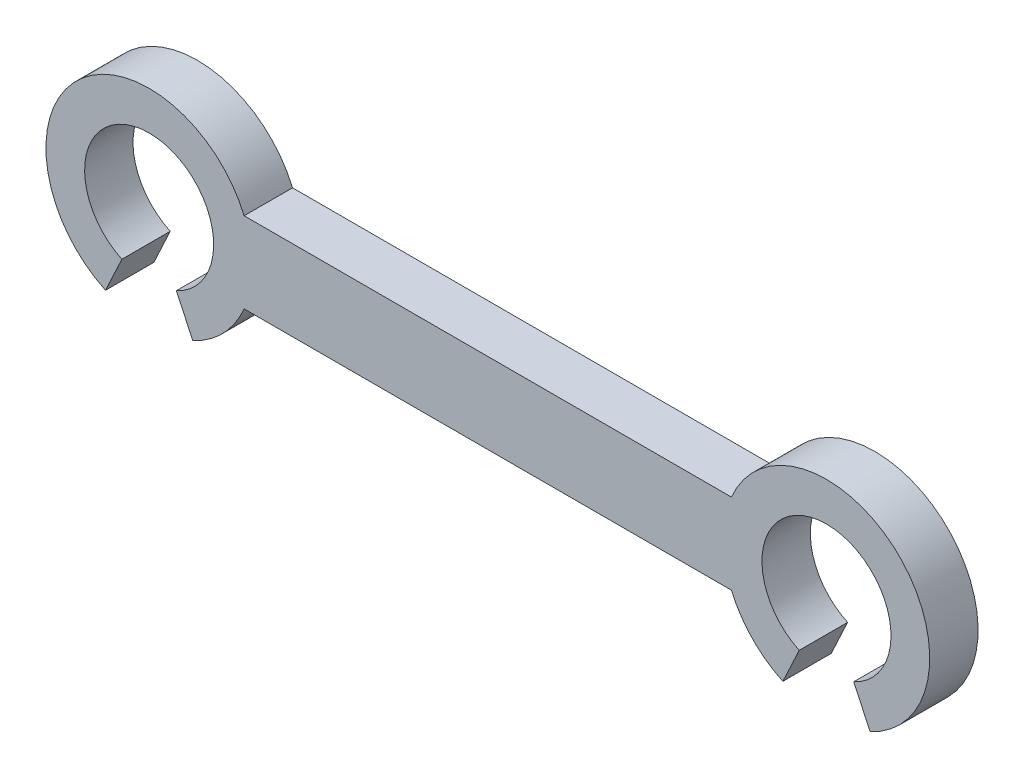
ISO-10303-21;
HEADER;
FILE_DESCRIPTION(('STEP AP214'),'2;1');
FILE_NAME('part.step','',(''),(''),'','','');
FILE_SCHEMA(('AUTOMOTIVE_DESIGN { 1 0 10303 214 1 1 1 1 }'));
ENDSEC;
DATA;
#1=APPLICATION_CONTEXT('core data for automotive mechanical design processes');
#2=APPLICATION_PROTOCOL_DEFINITION('international standard','automotive_design',2000,#1);
#3=PRODUCT_CONTEXT('',#1,'mechanical');
#4=PRODUCT('Part','Part','',(#3));
#5=PRODUCT_RELATED_PRODUCT_CATEGORY('part','',(#4));
#6=PRODUCT_DEFINITION_FORMATION('','',#4);
#7=PRODUCT_DEFINITION_CONTEXT('part definition',#1,'design');
#8=PRODUCT_DEFINITION('design','',#6,#7);
#9=PRODUCT_DEFINITION_SHAPE('','',#8);
#10=(LENGTH_UNIT() NAMED_UNIT(*) SI_UNIT(.MILLI.,.METRE.));
#11=(NAMED_UNIT(*) PLANE_ANGLE_UNIT() SI_UNIT($,.RADIAN.));
#12=(NAMED_UNIT(*) SI_UNIT($,.STERADIAN.) SOLID_ANGLE_UNIT());
#13=UNCERTAINTY_MEASURE_WITH_UNIT(LENGTH_MEASURE(1.E-05),#10,'distance_accuracy_value','');
#14=(GEOMETRIC_REPRESENTATION_CONTEXT(3) GLOBAL_UNCERTAINTY_ASSIGNED_CONTEXT((#13)) GLOBAL_UNIT_ASSIGNED_CONTEXT((#10,
#11,#12)) REPRESENTATION_CONTEXT('',''));
#15=CARTESIAN_POINT('',(0.,0.,0.));
#16=DIRECTION('',(0.,0.,1.));
#17=DIRECTION('',(1.,0.,0.));
#18=AXIS2_PLACEMENT_3D('',#15,#16,#17);
#19=CARTESIAN_POINT('',(-10.5,0.,1.5));
#20=DIRECTION('',(0.,0.,-1.));
#21=DIRECTION('',(-1.,0.,0.));
#22=AXIS2_PLACEMENT_3D('',#19,#20,#21);
#23=CYLINDRICAL_SURFACE('',#22,2.);
#24=CARTESIAN_POINT('',(-10.5,0.,0.));
#25=DIRECTION('',(0.,0.,1.));
#26=DIRECTION('',(1.,0.,0.));
#27=AXIS2_PLACEMENT_3D('',#24,#25,#26);
#28=CIRCLE('',#27,2.);
#29=CARTESIAN_POINT('',(-9.6547634765186,-1.8126155740733,0.));
#30=VERTEX_POINT('',#29);
#31=CARTESIAN_POINT('',(-11.3452365234814,-1.8126155740733,0.));
#32=VERTEX_POINT('',#31);
#33=EDGE_CURVE('E160',#30,#32,#28,.T.);
#34=ORIENTED_EDGE('',*,*,#33,.F.);
#35=DIRECTION('',(0.,0.,-1.));
#36=VECTOR('',#35,1.);
#37=CARTESIAN_POINT('',(-9.6547634765186,-1.8126155740733,1.5));
#38=LINE('',#37,#36);
#39=CARTESIAN_POINT('',(-9.6547634765186,-1.8126155740733,1.5));
#40=VERTEX_POINT('',#39);
#41=EDGE_CURVE('E11',#40,#30,#38,.T.);
#42=ORIENTED_EDGE('',*,*,#41,.F.);
#43=CARTESIAN_POINT('',(-10.5,0.,1.5));
#44=DIRECTION('',(0.,0.,1.));
#45=DIRECTION('',(1.,0.,0.));
#46=AXIS2_PLACEMENT_3D('',#43,#44,#45);
#47=CIRCLE('',#46,2.);
#48=CARTESIAN_POINT('',(-11.3452365234814,-1.8126155740733,1.5));
#49=VERTEX_POINT('',#48);
#50=EDGE_CURVE('E188',#40,#49,#47,.T.);
#51=ORIENTED_EDGE('',*,*,#50,.T.);
#52=DIRECTION('',(0.,0.,-1.));
#53=VECTOR('',#52,1.);
#54=CARTESIAN_POINT('',(-11.3452365234814,-1.8126155740733,1.5));
#55=LINE('',#54,#53);
#56=EDGE_CURVE('E57',#49,#32,#55,.T.);
#57=ORIENTED_EDGE('',*,*,#56,.T.);
#58=EDGE_LOOP('',(#34,#42,#51,#57));
#59=FACE_BOUND('',#58,.T.);
#60=ADVANCED_FACE('F41',(#59),#23,.F.);
#61=CARTESIAN_POINT('',(-8.62463495085432,-4.02173332637464,1.5));
#62=DIRECTION('',(0.906307787036649,0.4226182617407,0.));
#63=DIRECTION('',(-0.4226182617407,0.90630778703665,0.));
#64=AXIS2_PLACEMENT_3D('',#61,#62,#63);
#65=PLANE('',#64);
#66=DIRECTION('',(0.4226182617407,-0.90630778703665,0.));
#67=VECTOR('',#66,1.);
#68=CARTESIAN_POINT('',(-8.62463495085432,-4.02173332637464,0.));
#69=LINE('',#68,#67);
#70=CARTESIAN_POINT('',(-9.14762156242976,-2.90018491851728,0.));
#71=VERTEX_POINT('',#70);
#72=EDGE_CURVE('E162',#30,#71,#69,.T.);
#73=ORIENTED_EDGE('',*,*,#72,.T.);
#74=DIRECTION('',(0.,0.,-1.));
#75=VECTOR('',#74,1.);
#76=CARTESIAN_POINT('',(-9.14762156242976,-2.90018491851728,1.5));
#77=LINE('',#76,#75);
#78=CARTESIAN_POINT('',(-9.14762156242976,-2.90018491851728,1.5));
#79=VERTEX_POINT('',#78);
#80=EDGE_CURVE('E49',#79,#71,#77,.T.);
#81=ORIENTED_EDGE('',*,*,#80,.F.);
#82=DIRECTION('',(0.4226182617407,-0.90630778703665,0.));
#83=VECTOR('',#82,1.);
#84=CARTESIAN_POINT('',(-8.62463495085432,-4.02173332637464,1.5));
#85=LINE('',#84,#83);
#86=EDGE_CURVE('E403',#40,#79,#85,.T.);
#87=ORIENTED_EDGE('',*,*,#86,.F.);
#88=ORIENTED_EDGE('',*,*,#41,.T.);
#89=EDGE_LOOP('',(#73,#81,#87,#88));
#90=FACE_BOUND('',#89,.T.);
#91=ADVANCED_FACE('F260',(#90),#65,.F.);
#92=CARTESIAN_POINT('',(-10.5,0.,1.5));
#93=DIRECTION('',(0.,0.,-1.));
#94=DIRECTION('',(-1.,0.,0.));
#95=AXIS2_PLACEMENT_3D('',#92,#93,#94);
#96=CYLINDRICAL_SURFACE('',#95,3.2);
#97=CARTESIAN_POINT('',(-10.5,0.,0.));
#98=DIRECTION('',(0.,0.,1.));
#99=DIRECTION('',(1.,0.,0.));
#100=AXIS2_PLACEMENT_3D('',#97,#98,#99);
#101=CIRCLE('',#100,3.2);
#102=CARTESIAN_POINT('',(-7.55424033566891,-1.25,0.));
#103=VERTEX_POINT('',#102);
#104=EDGE_CURVE('E164',#71,#103,#101,.T.);
#105=ORIENTED_EDGE('',*,*,#104,.T.);
#106=DIRECTION('',(0.,0.,-1.));
#107=VECTOR('',#106,1.);
#108=CARTESIAN_POINT('',(-7.55424033566891,-1.25,1.5));
#109=LINE('',#108,#107);
#110=CARTESIAN_POINT('',(-7.55424033566891,-1.25,1.5));
#111=VERTEX_POINT('',#110);
#112=EDGE_CURVE('E204',#111,#103,#109,.T.);
#113=ORIENTED_EDGE('',*,*,#112,.F.);
#114=CARTESIAN_POINT('',(-10.5,0.,1.5));
#115=DIRECTION('',(0.,0.,1.));
#116=DIRECTION('',(1.,0.,0.));
#117=AXIS2_PLACEMENT_3D('',#114,#115,#116);
#118=CIRCLE('',#117,3.2);
#119=EDGE_CURVE('E213',#79,#111,#118,.T.);
#120=ORIENTED_EDGE('',*,*,#119,.F.);
#121=ORIENTED_EDGE('',*,*,#80,.T.);
#122=EDGE_LOOP('',(#105,#113,#120,#121));
#123=FACE_BOUND('',#122,.T.);
#124=ADVANCED_FACE('F211',(#123),#96,.T.);
#125=CARTESIAN_POINT('',(0.,-1.25,1.5));
#126=DIRECTION('',(0.,1.,0.));
#127=DIRECTION('',(0.,0.,1.));
#128=AXIS2_PLACEMENT_3D('',#125,#126,#127);
#129=PLANE('',#128);
#130=DIRECTION('',(1.,0.,0.));
#131=VECTOR('',#130,1.);
#132=CARTESIAN_POINT('',(0.,-1.25,0.));
#133=LINE('',#132,#131);
#134=CARTESIAN_POINT('',(7.55424033566891,-1.25,0.));
#135=VERTEX_POINT('',#134);
#136=EDGE_CURVE('E166',#103,#135,#133,.T.);
#137=ORIENTED_EDGE('',*,*,#136,.T.);
#138=DIRECTION('',(0.,0.,-1.));
#139=VECTOR('',#138,1.);
#140=CARTESIAN_POINT('',(7.55424033566891,-1.25,1.5));
#141=LINE('',#140,#139);
#142=CARTESIAN_POINT('',(7.55424033566891,-1.25,1.5));
#143=VERTEX_POINT('',#142);
#144=EDGE_CURVE('E201',#143,#135,#141,.T.);
#145=ORIENTED_EDGE('',*,*,#144,.F.);
#146=DIRECTION('',(1.,0.,0.));
#147=VECTOR('',#146,1.);
#148=CARTESIAN_POINT('',(0.,-1.25,1.5));
#149=LINE('',#148,#147);
#150=EDGE_CURVE('E232',#111,#143,#149,.T.);
#151=ORIENTED_EDGE('',*,*,#150,.F.);
#152=ORIENTED_EDGE('',*,*,#112,.T.);
#153=EDGE_LOOP('',(#137,#145,#151,#152));
#154=FACE_BOUND('',#153,.T.);
#155=ADVANCED_FACE('F222',(#154),#129,.F.);
#156=CARTESIAN_POINT('',(10.5,0.,1.5));
#157=DIRECTION('',(0.,0.,-1.));
#158=DIRECTION('',(-1.,0.,0.));
#159=AXIS2_PLACEMENT_3D('',#156,#157,#158);
#160=CYLINDRICAL_SURFACE('',#159,3.2);
#161=CARTESIAN_POINT('',(10.5,0.,0.));
#162=DIRECTION('',(0.,0.,1.));
#163=DIRECTION('',(1.,0.,0.));
#164=AXIS2_PLACEMENT_3D('',#161,#162,#163);
#165=CIRCLE('',#164,3.2);
#166=CARTESIAN_POINT('',(9.14762156242976,-2.90018491851728,0.));
#167=VERTEX_POINT('',#166);
#168=EDGE_CURVE('E168',#135,#167,#165,.T.);
#169=ORIENTED_EDGE('',*,*,#168,.T.);
#170=DIRECTION('',(0.,0.,-1.));
#171=VECTOR('',#170,1.);
#172=CARTESIAN_POINT('',(9.14762156242976,-2.90018491851728,1.5));
#173=LINE('',#172,#171);
#174=CARTESIAN_POINT('',(9.14762156242976,-2.90018491851728,1.5));
#175=VERTEX_POINT('',#174);
#176=EDGE_CURVE('E199',#175,#167,#173,.T.);
#177=ORIENTED_EDGE('',*,*,#176,.F.);
#178=CARTESIAN_POINT('',(10.5,0.,1.5));
#179=DIRECTION('',(0.,0.,1.));
#180=DIRECTION('',(1.,0.,0.));
#181=AXIS2_PLACEMENT_3D('',#178,#179,#180);
#182=CIRCLE('',#181,3.2);
#183=EDGE_CURVE('E228',#143,#175,#182,.T.);
#184=ORIENTED_EDGE('',*,*,#183,.F.);
#185=ORIENTED_EDGE('',*,*,#144,.T.);
#186=EDGE_LOOP('',(#169,#177,#184,#185));
#187=FACE_BOUND('',#186,.T.);
#188=ADVANCED_FACE('F226',(#187),#160,.T.);
#189=CARTESIAN_POINT('',(8.62463495085433,-4.02173332637464,1.5));
#190=DIRECTION('',(0.906307787036649,-0.4226182617407,0.));
#191=DIRECTION('',(0.4226182617407,0.906307787036649,0.));
#192=AXIS2_PLACEMENT_3D('',#189,#190,#191);
#193=PLANE('',#192);
#194=DIRECTION('',(-0.4226182617407,-0.90630778703665,0.));
#195=VECTOR('',#194,1.);
#196=CARTESIAN_POINT('',(8.62463495085433,-4.02173332637464,0.));
#197=LINE('',#196,#195);
#198=CARTESIAN_POINT('',(9.6547634765186,-1.8126155740733,0.));
#199=VERTEX_POINT('',#198);
#200=EDGE_CURVE('E171',#199,#167,#197,.T.);
#201=ORIENTED_EDGE('',*,*,#200,.F.);
#202=DIRECTION('',(0.,0.,-1.));
#203=VECTOR('',#202,1.);
#204=CARTESIAN_POINT('',(9.6547634765186,-1.8126155740733,1.5));
#205=LINE('',#204,#203);
#206=CARTESIAN_POINT('',(9.6547634765186,-1.8126155740733,1.5));
#207=VERTEX_POINT('',#206);
#208=EDGE_CURVE('E197',#207,#199,#205,.T.);
#209=ORIENTED_EDGE('',*,*,#208,.F.);
#210=DIRECTION('',(-0.4226182617407,-0.90630778703665,0.));
#211=VECTOR('',#210,1.);
#212=CARTESIAN_POINT('',(8.62463495085433,-4.02173332637464,1.5));
#213=LINE('',#212,#211);
#214=EDGE_CURVE('E231',#207,#175,#213,.T.);
#215=ORIENTED_EDGE('',*,*,#214,.T.);
#216=ORIENTED_EDGE('',*,*,#176,.T.);
#217=EDGE_LOOP('',(#201,#209,#215,#216));
#218=FACE_BOUND('',#217,.T.);
#219=ADVANCED_FACE('F273',(#218),#193,.T.);
#220=CARTESIAN_POINT('',(10.5,0.,1.5));
#221=DIRECTION('',(0.,0.,-1.));
#222=DIRECTION('',(-1.,0.,0.));
#223=AXIS2_PLACEMENT_3D('',#220,#221,#222);
#224=CYLINDRICAL_SURFACE('',#223,2.);
#225=CARTESIAN_POINT('',(10.5,0.,0.));
#226=DIRECTION('',(0.,0.,1.));
#227=DIRECTION('',(1.,0.,0.));
#228=AXIS2_PLACEMENT_3D('',#225,#226,#227);
#229=CIRCLE('',#228,2.);
#230=CARTESIAN_POINT('',(11.3452365234814,-1.8126155740733,0.));
#231=VERTEX_POINT('',#230);
#232=EDGE_CURVE('E174',#231,#199,#229,.T.);
#233=ORIENTED_EDGE('',*,*,#232,.F.);
#234=DIRECTION('',(0.,0.,-1.));
#235=VECTOR('',#234,1.);
#236=CARTESIAN_POINT('',(11.3452365234814,-1.8126155740733,1.5));
#237=LINE('',#236,#235);
#238=CARTESIAN_POINT('',(11.3452365234814,-1.8126155740733,1.5));
#239=VERTEX_POINT('',#238);
#240=EDGE_CURVE('E195',#239,#231,#237,.T.);
#241=ORIENTED_EDGE('',*,*,#240,.F.);
#242=CARTESIAN_POINT('',(10.5,0.,1.5));
#243=DIRECTION('',(0.,0.,1.));
#244=DIRECTION('',(1.,0.,0.));
#245=AXIS2_PLACEMENT_3D('',#242,#243,#244);
#246=CIRCLE('',#245,2.);
#247=EDGE_CURVE('E234',#239,#207,#246,.T.);
#248=ORIENTED_EDGE('',*,*,#247,.T.);
#249=ORIENTED_EDGE('',*,*,#208,.T.);
#250=EDGE_LOOP('',(#233,#241,#248,#249));
#251=FACE_BOUND('',#250,.T.);
#252=ADVANCED_FACE('F276',(#251),#224,.F.);
#253=CARTESIAN_POINT('',(8.62463495085433,4.02173332637464,1.5));
#254=DIRECTION('',(0.906307787036649,0.4226182617407,0.));
#255=DIRECTION('',(-0.4226182617407,0.90630778703665,0.));
#256=AXIS2_PLACEMENT_3D('',#253,#254,#255);
#257=PLANE('',#256);
#258=DIRECTION('',(0.4226182617407,-0.90630778703665,0.));
#259=VECTOR('',#258,1.);
#260=CARTESIAN_POINT('',(8.62463495085433,4.02173332637464,0.));
#261=LINE('',#260,#259);
#262=CARTESIAN_POINT('',(11.8523784375702,-2.90018491851728,0.));
#263=VERTEX_POINT('',#262);
#264=EDGE_CURVE('E177',#231,#263,#261,.T.);
#265=ORIENTED_EDGE('',*,*,#264,.T.);
#266=DIRECTION('',(0.,0.,-1.));
#267=VECTOR('',#266,1.);
#268=CARTESIAN_POINT('',(11.8523784375702,-2.90018491851728,1.5));
#269=LINE('',#268,#267);
#270=CARTESIAN_POINT('',(11.8523784375702,-2.90018491851728,1.5));
#271=VERTEX_POINT('',#270);
#272=EDGE_CURVE('E192',#271,#263,#269,.T.);
#273=ORIENTED_EDGE('',*,*,#272,.F.);
#274=DIRECTION('',(0.4226182617407,-0.90630778703665,0.));
#275=VECTOR('',#274,1.);
#276=CARTESIAN_POINT('',(8.62463495085433,4.02173332637464,1.5));
#277=LINE('',#276,#275);
#278=EDGE_CURVE('E155',#239,#271,#277,.T.);
#279=ORIENTED_EDGE('',*,*,#278,.F.);
#280=ORIENTED_EDGE('',*,*,#240,.T.);
#281=EDGE_LOOP('',(#265,#273,#279,#280));
#282=FACE_BOUND('',#281,.T.);
#283=ADVANCED_FACE('F244',(#282),#257,.F.);
#284=CARTESIAN_POINT('',(10.5,0.,1.5));
#285=DIRECTION('',(0.,0.,-1.));
#286=DIRECTION('',(-1.,0.,0.));
#287=AXIS2_PLACEMENT_3D('',#284,#285,#286);
#288=CYLINDRICAL_SURFACE('',#287,3.2);
#289=CARTESIAN_POINT('',(10.5,0.,0.));
#290=DIRECTION('',(0.,0.,1.));
#291=DIRECTION('',(1.,0.,0.));
#292=AXIS2_PLACEMENT_3D('',#289,#290,#291);
#293=CIRCLE('',#292,3.2);
#294=CARTESIAN_POINT('',(7.55424033566891,1.25,0.));
#295=VERTEX_POINT('',#294);
#296=EDGE_CURVE('E179',#263,#295,#293,.T.);
#297=ORIENTED_EDGE('',*,*,#296,.T.);
#298=DIRECTION('',(0.,0.,-1.));
#299=VECTOR('',#298,1.);
#300=CARTESIAN_POINT('',(7.55424033566891,1.25,1.5));
#301=LINE('',#300,#299);
#302=CARTESIAN_POINT('',(7.55424033566891,1.25,1.5));
#303=VERTEX_POINT('',#302);
#304=EDGE_CURVE('E141',#303,#295,#301,.T.);
#305=ORIENTED_EDGE('',*,*,#304,.F.);
#306=CARTESIAN_POINT('',(10.5,0.,1.5));
#307=DIRECTION('',(0.,0.,1.));
#308=DIRECTION('',(1.,0.,0.));
#309=AXIS2_PLACEMENT_3D('',#306,#307,#308);
#310=CIRCLE('',#309,3.2);
#311=EDGE_CURVE('E152',#271,#303,#310,.T.);
#312=ORIENTED_EDGE('',*,*,#311,.F.);
#313=ORIENTED_EDGE('',*,*,#272,.T.);
#314=EDGE_LOOP('',(#297,#305,#312,#313));
#315=FACE_BOUND('',#314,.T.);
#316=ADVANCED_FACE('F248',(#315),#288,.T.);
#317=CARTESIAN_POINT('',(0.,1.25,1.5));
#318=DIRECTION('',(0.,1.,0.));
#319=DIRECTION('',(0.,0.,1.));
#320=AXIS2_PLACEMENT_3D('',#317,#318,#319);
#321=PLANE('',#320);
#322=DIRECTION('',(1.,0.,0.));
#323=VECTOR('',#322,1.);
#324=CARTESIAN_POINT('',(0.,1.25,0.));
#325=LINE('',#324,#323);
#326=CARTESIAN_POINT('',(-7.55424033566891,1.25,0.));
#327=VERTEX_POINT('',#326);
#328=EDGE_CURVE('E138',#327,#295,#325,.T.);
#329=ORIENTED_EDGE('',*,*,#328,.F.);
#330=DIRECTION('',(0.,0.,-1.));
#331=VECTOR('',#330,1.);
#332=CARTESIAN_POINT('',(-7.55424033566891,1.25,1.5));
#333=LINE('',#332,#331);
#334=CARTESIAN_POINT('',(-7.55424033566891,1.25,1.5));
#335=VERTEX_POINT('',#334);
#336=EDGE_CURVE('E132',#335,#327,#333,.T.);
#337=ORIENTED_EDGE('',*,*,#336,.F.);
#338=DIRECTION('',(1.,0.,0.));
#339=VECTOR('',#338,1.);
#340=CARTESIAN_POINT('',(0.,1.25,1.5));
#341=LINE('',#340,#339);
#342=EDGE_CURVE('E136',#335,#303,#341,.T.);
#343=ORIENTED_EDGE('',*,*,#342,.T.);
#344=ORIENTED_EDGE('',*,*,#304,.T.);
#345=EDGE_LOOP('',(#329,#337,#343,#344));
#346=FACE_BOUND('',#345,.T.);
#347=ADVANCED_FACE('F134',(#346),#321,.T.);
#348=CARTESIAN_POINT('',(-10.5,0.,1.5));
#349=DIRECTION('',(0.,0.,-1.));
#350=DIRECTION('',(-1.,0.,0.));
#351=AXIS2_PLACEMENT_3D('',#348,#349,#350);
#352=CYLINDRICAL_SURFACE('',#351,3.2);
#353=CARTESIAN_POINT('',(-10.5,0.,0.));
#354=DIRECTION('',(0.,0.,1.));
#355=DIRECTION('',(1.,0.,0.));
#356=AXIS2_PLACEMENT_3D('',#353,#354,#355);
#357=CIRCLE('',#356,3.2);
#358=CARTESIAN_POINT('',(-11.8523784375702,-2.90018491851728,0.));
#359=VERTEX_POINT('',#358);
#360=EDGE_CURVE('E183',#327,#359,#357,.T.);
#361=ORIENTED_EDGE('',*,*,#360,.T.);
#362=DIRECTION('',(0.,0.,-1.));
#363=VECTOR('',#362,1.);
#364=CARTESIAN_POINT('',(-11.8523784375702,-2.90018491851728,1.5));
#365=LINE('',#364,#363);
#366=CARTESIAN_POINT('',(-11.8523784375702,-2.90018491851728,1.5));
#367=VERTEX_POINT('',#366);
#368=EDGE_CURVE('E95',#367,#359,#365,.T.);
#369=ORIENTED_EDGE('',*,*,#368,.F.);
#370=CARTESIAN_POINT('',(-10.5,0.,1.5));
#371=DIRECTION('',(0.,0.,1.));
#372=DIRECTION('',(1.,0.,0.));
#373=AXIS2_PLACEMENT_3D('',#370,#371,#372);
#374=CIRCLE('',#373,3.2);
#375=EDGE_CURVE('E143',#335,#367,#374,.T.);
#376=ORIENTED_EDGE('',*,*,#375,.F.);
#377=ORIENTED_EDGE('',*,*,#336,.T.);
#378=EDGE_LOOP('',(#361,#369,#376,#377));
#379=FACE_BOUND('',#378,.T.);
#380=ADVANCED_FACE('F144',(#379),#352,.T.);
#381=CARTESIAN_POINT('',(-8.62463495085433,4.02173332637464,1.5));
#382=DIRECTION('',(0.906307787036649,-0.4226182617407,0.));
#383=DIRECTION('',(0.4226182617407,0.90630778703665,0.));
#384=AXIS2_PLACEMENT_3D('',#381,#382,#383);
#385=PLANE('',#384);
#386=DIRECTION('',(-0.4226182617407,-0.90630778703665,0.));
#387=VECTOR('',#386,1.);
#388=CARTESIAN_POINT('',(-8.62463495085433,4.02173332637464,0.));
#389=LINE('',#388,#387);
#390=EDGE_CURVE('E185',#32,#359,#389,.T.);
#391=ORIENTED_EDGE('',*,*,#390,.F.);
#392=ORIENTED_EDGE('',*,*,#56,.F.);
#393=DIRECTION('',(-0.4226182617407,-0.90630778703665,0.));
#394=VECTOR('',#393,1.);
#395=CARTESIAN_POINT('',(-8.62463495085433,4.02173332637464,1.5));
#396=LINE('',#395,#394);
#397=EDGE_CURVE('E147',#49,#367,#396,.T.);
#398=ORIENTED_EDGE('',*,*,#397,.T.);
#399=ORIENTED_EDGE('',*,*,#368,.T.);
#400=EDGE_LOOP('',(#391,#392,#398,#399));
#401=FACE_BOUND('',#400,.T.);
#402=ADVANCED_FACE('F249',(#401),#385,.T.);
#403=CARTESIAN_POINT('',(0.,0.,1.5));
#404=DIRECTION('',(0.,0.,1.));
#405=DIRECTION('',(1.,0.,0.));
#406=AXIS2_PLACEMENT_3D('',#403,#404,#405);
#407=PLANE('',#406);
#408=ORIENTED_EDGE('',*,*,#50,.F.);
#409=ORIENTED_EDGE('',*,*,#86,.T.);
#410=ORIENTED_EDGE('',*,*,#119,.T.);
#411=ORIENTED_EDGE('',*,*,#150,.T.);
#412=ORIENTED_EDGE('',*,*,#183,.T.);
#413=ORIENTED_EDGE('',*,*,#214,.F.);
#414=ORIENTED_EDGE('',*,*,#247,.F.);
#415=ORIENTED_EDGE('',*,*,#278,.T.);
#416=ORIENTED_EDGE('',*,*,#311,.T.);
#417=ORIENTED_EDGE('',*,*,#342,.F.);
#418=ORIENTED_EDGE('',*,*,#375,.T.);
#419=ORIENTED_EDGE('',*,*,#397,.F.);
#420=EDGE_LOOP('',(#408,#409,#410,#411,#412,#413,#414,#415,#416,#417,#418,#419));
#421=FACE_BOUND('',#420,.T.);
#422=ADVANCED_FACE('F150',(#421),#407,.T.);
#423=CARTESIAN_POINT('',(0.,0.,0.));
#424=DIRECTION('',(0.,0.,1.));
#425=DIRECTION('',(1.,0.,0.));
#426=AXIS2_PLACEMENT_3D('',#423,#424,#425);
#427=PLANE('',#426);
#428=ORIENTED_EDGE('',*,*,#33,.T.);
#429=ORIENTED_EDGE('',*,*,#390,.T.);
#430=ORIENTED_EDGE('',*,*,#360,.F.);
#431=ORIENTED_EDGE('',*,*,#328,.T.);
#432=ORIENTED_EDGE('',*,*,#296,.F.);
#433=ORIENTED_EDGE('',*,*,#264,.F.);
#434=ORIENTED_EDGE('',*,*,#232,.T.);
#435=ORIENTED_EDGE('',*,*,#200,.T.);
#436=ORIENTED_EDGE('',*,*,#168,.F.);
#437=ORIENTED_EDGE('',*,*,#136,.F.);
#438=ORIENTED_EDGE('',*,*,#104,.F.);
#439=ORIENTED_EDGE('',*,*,#72,.F.);
#440=EDGE_LOOP('',(#428,#429,#430,#431,#432,#433,#434,#435,#436,#437,#438,#439));
#441=FACE_BOUND('',#440,.T.);
#442=ADVANCED_FACE('F218',(#441),#427,.F.);
#443=CLOSED_SHELL('',(#60,#91,#124,#155,#188,#219,#252,#283,#316,#347,#380,#402,#422,#442));
#444=MANIFOLD_SOLID_BREP('B2',#443);
#445=ADVANCED_BREP_SHAPE_REPRESENTATION('',(#18,#444),#14);
#446=SHAPE_DEFINITION_REPRESENTATION(#9,#445);
ENDSEC;
END-ISO-10303-21;
